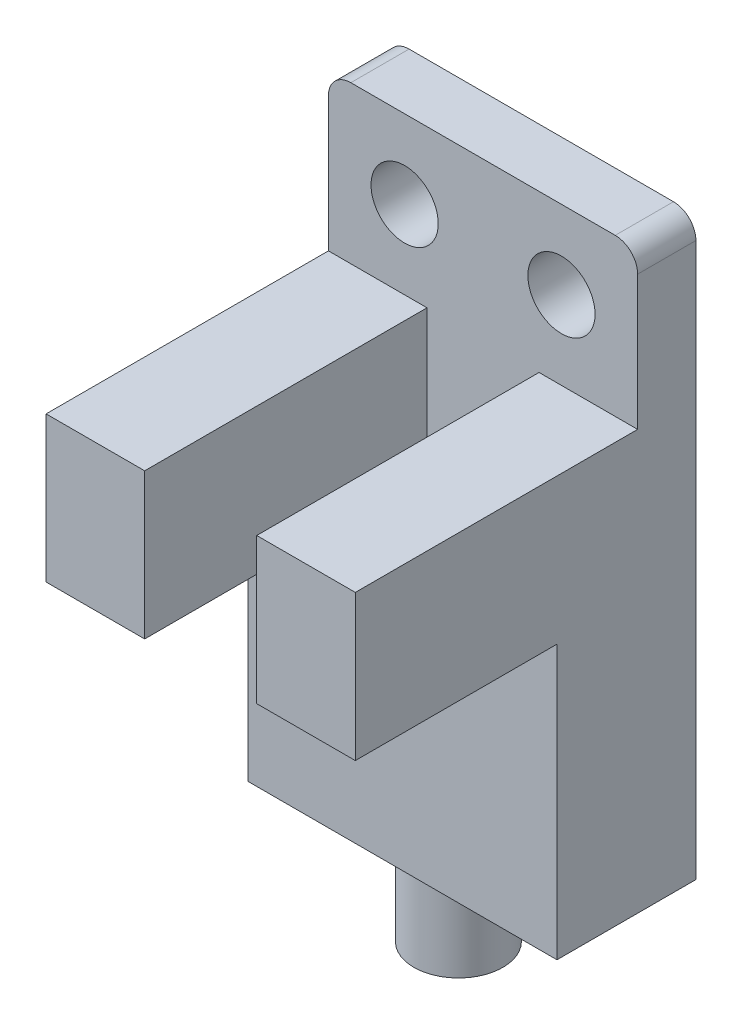
ISO-10303-21;
HEADER;
FILE_DESCRIPTION(('STEP AP214'),'2;1');
FILE_NAME('part.step','',(''),(''),'','','');
FILE_SCHEMA(('AUTOMOTIVE_DESIGN { 1 0 10303 214 1 1 1 1 }'));
ENDSEC;
DATA;
#1=APPLICATION_CONTEXT('core data for automotive mechanical design processes');
#2=APPLICATION_PROTOCOL_DEFINITION('international standard','automotive_design',2000,#1);
#3=PRODUCT_CONTEXT('',#1,'mechanical');
#4=PRODUCT('Part','Part','',(#3));
#5=PRODUCT_RELATED_PRODUCT_CATEGORY('part','',(#4));
#6=PRODUCT_DEFINITION_FORMATION('','',#4);
#7=PRODUCT_DEFINITION_CONTEXT('part definition',#1,'design');
#8=PRODUCT_DEFINITION('design','',#6,#7);
#9=PRODUCT_DEFINITION_SHAPE('','',#8);
#10=(LENGTH_UNIT() NAMED_UNIT(*) SI_UNIT(.MILLI.,.METRE.));
#11=(NAMED_UNIT(*) PLANE_ANGLE_UNIT() SI_UNIT($,.RADIAN.));
#12=(NAMED_UNIT(*) SI_UNIT($,.STERADIAN.) SOLID_ANGLE_UNIT());
#13=UNCERTAINTY_MEASURE_WITH_UNIT(LENGTH_MEASURE(1.E-05),#10,'distance_accuracy_value','');
#14=(GEOMETRIC_REPRESENTATION_CONTEXT(3) GLOBAL_UNCERTAINTY_ASSIGNED_CONTEXT((#13)) GLOBAL_UNIT_ASSIGNED_CONTEXT((#10,
#11,#12)) REPRESENTATION_CONTEXT('',''));
#15=CARTESIAN_POINT('',(0.,0.,0.));
#16=DIRECTION('',(0.,0.,1.));
#17=DIRECTION('',(1.,0.,0.));
#18=AXIS2_PLACEMENT_3D('',#15,#16,#17);
#19=CARTESIAN_POINT('',(0.,-4.,0.));
#20=DIRECTION('',(0.,-1.,0.));
#21=DIRECTION('',(0.,0.,-1.));
#22=AXIS2_PLACEMENT_3D('',#19,#20,#21);
#23=PLANE('',#22);
#24=CARTESIAN_POINT('',(6.9,-4.,3.69876481393757));
#25=DIRECTION('',(0.,1.,0.));
#26=DIRECTION('',(0.,0.,1.));
#27=AXIS2_PLACEMENT_3D('',#24,#25,#26);
#28=CIRCLE('',#27,1.98716484330452);
#29=CARTESIAN_POINT('',(6.9,-4.,5.68592965724209));
#30=VERTEX_POINT('',#29);
#31=EDGE_CURVE('E211',#30,#30,#28,.T.);
#32=ORIENTED_EDGE('',*,*,#31,.F.);
#33=EDGE_LOOP('',(#32));
#34=FACE_BOUND('',#33,.T.);
#35=ADVANCED_FACE('F19',(#34),#23,.T.);
#36=CARTESIAN_POINT('',(9.4,12.2,15.2));
#37=DIRECTION('',(1.,0.,0.));
#38=DIRECTION('',(0.,0.,-1.));
#39=AXIS2_PLACEMENT_3D('',#36,#37,#38);
#40=PLANE('',#39);
#41=DIRECTION('',(0.,0.,1.));
#42=VECTOR('',#41,1.);
#43=CARTESIAN_POINT('',(9.4,12.2,6.2));
#44=LINE('',#43,#42);
#45=CARTESIAN_POINT('',(9.4,12.2,2.6));
#46=VERTEX_POINT('',#45);
#47=CARTESIAN_POINT('',(9.4,12.2,6.2));
#48=VERTEX_POINT('',#47);
#49=EDGE_CURVE('E120',#46,#48,#44,.T.);
#50=ORIENTED_EDGE('',*,*,#49,.T.);
#51=DIRECTION('',(0.,0.,1.));
#52=VECTOR('',#51,1.);
#53=CARTESIAN_POINT('',(9.4,12.2,15.2));
#54=LINE('',#53,#52);
#55=CARTESIAN_POINT('',(9.4,12.2,15.2));
#56=VERTEX_POINT('',#55);
#57=EDGE_CURVE('E171',#48,#56,#54,.T.);
#58=ORIENTED_EDGE('',*,*,#57,.T.);
#59=DIRECTION('',(0.,1.,0.));
#60=VECTOR('',#59,1.);
#61=CARTESIAN_POINT('',(9.4,0.,15.2));
#62=LINE('',#61,#60);
#63=CARTESIAN_POINT('',(9.4,18.7,15.2));
#64=VERTEX_POINT('',#63);
#65=EDGE_CURVE('E173',#64,#56,#62,.F.);
#66=ORIENTED_EDGE('',*,*,#65,.F.);
#67=DIRECTION('',(0.,0.,-1.));
#68=VECTOR('',#67,1.);
#69=CARTESIAN_POINT('',(9.4,18.7,15.2));
#70=LINE('',#69,#68);
#71=CARTESIAN_POINT('',(9.4,18.7,2.6));
#72=VERTEX_POINT('',#71);
#73=EDGE_CURVE('E123',#64,#72,#70,.T.);
#74=ORIENTED_EDGE('',*,*,#73,.T.);
#75=DIRECTION('',(0.,1.,0.));
#76=VECTOR('',#75,1.);
#77=CARTESIAN_POINT('',(9.4,0.,2.6));
#78=LINE('',#77,#76);
#79=EDGE_CURVE('E117',#72,#46,#78,.F.);
#80=ORIENTED_EDGE('',*,*,#79,.T.);
#81=EDGE_LOOP('',(#50,#58,#66,#74,#80));
#82=FACE_BOUND('',#81,.T.);
#83=ADVANCED_FACE('F119',(#82),#40,.F.);
#84=CARTESIAN_POINT('',(0.,12.2,6.2));
#85=DIRECTION('',(0.,-1.,0.));
#86=DIRECTION('',(1.,0.,0.));
#87=AXIS2_PLACEMENT_3D('',#84,#85,#86);
#88=PLANE('',#87);
#89=DIRECTION('',(-1.,0.,0.));
#90=VECTOR('',#89,1.);
#91=CARTESIAN_POINT('',(0.,12.2,2.6));
#92=LINE('',#91,#90);
#93=CARTESIAN_POINT('',(4.4,12.2,2.6));
#94=VERTEX_POINT('',#93);
#95=EDGE_CURVE('E128',#46,#94,#92,.T.);
#96=ORIENTED_EDGE('',*,*,#95,.T.);
#97=DIRECTION('',(0.,0.,1.));
#98=VECTOR('',#97,1.);
#99=CARTESIAN_POINT('',(4.4,12.2,15.2));
#100=LINE('',#99,#98);
#101=CARTESIAN_POINT('',(4.4,12.2,6.2));
#102=VERTEX_POINT('',#101);
#103=EDGE_CURVE('E137',#94,#102,#100,.T.);
#104=ORIENTED_EDGE('',*,*,#103,.T.);
#105=DIRECTION('',(1.,0.,0.));
#106=VECTOR('',#105,1.);
#107=CARTESIAN_POINT('',(0.,12.2,6.2));
#108=LINE('',#107,#106);
#109=EDGE_CURVE('E135',#48,#102,#108,.F.);
#110=ORIENTED_EDGE('',*,*,#109,.F.);
#111=ORIENTED_EDGE('',*,*,#49,.F.);
#112=EDGE_LOOP('',(#96,#104,#110,#111));
#113=FACE_BOUND('',#112,.T.);
#114=ADVANCED_FACE('F133',(#113),#88,.F.);
#115=CARTESIAN_POINT('',(4.4,12.2,15.2));
#116=DIRECTION('',(-1.,0.,0.));
#117=DIRECTION('',(0.,0.,1.));
#118=AXIS2_PLACEMENT_3D('',#115,#116,#117);
#119=PLANE('',#118);
#120=DIRECTION('',(0.,0.,-1.));
#121=VECTOR('',#120,1.);
#122=CARTESIAN_POINT('',(4.4,18.7,15.2));
#123=LINE('',#122,#121);
#124=CARTESIAN_POINT('',(4.4,18.7,2.6));
#125=VERTEX_POINT('',#124);
#126=CARTESIAN_POINT('',(4.4,18.7,15.2));
#127=VERTEX_POINT('',#126);
#128=EDGE_CURVE('E213',#125,#127,#123,.F.);
#129=ORIENTED_EDGE('',*,*,#128,.T.);
#130=DIRECTION('',(0.,1.,0.));
#131=VECTOR('',#130,1.);
#132=CARTESIAN_POINT('',(4.4,0.,15.2));
#133=LINE('',#132,#131);
#134=CARTESIAN_POINT('',(4.4,12.2,15.2));
#135=VERTEX_POINT('',#134);
#136=EDGE_CURVE('E176',#127,#135,#133,.F.);
#137=ORIENTED_EDGE('',*,*,#136,.T.);
#138=DIRECTION('',(0.,0.,1.));
#139=VECTOR('',#138,1.);
#140=CARTESIAN_POINT('',(4.4,12.2,15.2));
#141=LINE('',#140,#139);
#142=EDGE_CURVE('E160',#135,#102,#141,.F.);
#143=ORIENTED_EDGE('',*,*,#142,.T.);
#144=ORIENTED_EDGE('',*,*,#103,.F.);
#145=DIRECTION('',(0.,1.,0.));
#146=VECTOR('',#145,1.);
#147=CARTESIAN_POINT('',(4.4,0.,2.6));
#148=LINE('',#147,#146);
#149=EDGE_CURVE('E82',#94,#125,#148,.T.);
#150=ORIENTED_EDGE('',*,*,#149,.T.);
#151=EDGE_LOOP('',(#129,#137,#143,#144,#150));
#152=FACE_BOUND('',#151,.T.);
#153=ADVANCED_FACE('F228',(#152),#119,.F.);
#154=CARTESIAN_POINT('',(13.8,12.2,15.2));
#155=DIRECTION('',(0.,1.,0.));
#156=DIRECTION('',(-1.,0.,0.));
#157=AXIS2_PLACEMENT_3D('',#154,#155,#156);
#158=PLANE('',#157);
#159=DIRECTION('',(0.,0.,1.));
#160=VECTOR('',#159,1.);
#161=CARTESIAN_POINT('',(13.8,12.2,2.6));
#162=LINE('',#161,#160);
#163=CARTESIAN_POINT('',(13.8,12.2,6.2));
#164=VERTEX_POINT('',#163);
#165=CARTESIAN_POINT('',(13.8,12.2,15.2));
#166=VERTEX_POINT('',#165);
#167=EDGE_CURVE('E254',#164,#166,#162,.T.);
#168=ORIENTED_EDGE('',*,*,#167,.T.);
#169=DIRECTION('',(1.,0.,0.));
#170=VECTOR('',#169,1.);
#171=CARTESIAN_POINT('',(0.,12.2,15.2));
#172=LINE('',#171,#170);
#173=EDGE_CURVE('E184',#56,#166,#172,.T.);
#174=ORIENTED_EDGE('',*,*,#173,.F.);
#175=ORIENTED_EDGE('',*,*,#57,.F.);
#176=DIRECTION('',(1.,0.,0.));
#177=VECTOR('',#176,1.);
#178=CARTESIAN_POINT('',(0.,12.2,6.2));
#179=LINE('',#178,#177);
#180=EDGE_CURVE('E163',#164,#48,#179,.F.);
#181=ORIENTED_EDGE('',*,*,#180,.F.);
#182=EDGE_LOOP('',(#168,#174,#175,#181));
#183=FACE_BOUND('',#182,.T.);
#184=ADVANCED_FACE('F529',(#183),#158,.F.);
#185=CARTESIAN_POINT('',(0.,0.,15.2));
#186=DIRECTION('',(0.,0.,1.));
#187=DIRECTION('',(1.,0.,0.));
#188=AXIS2_PLACEMENT_3D('',#185,#186,#187);
#189=PLANE('',#188);
#190=ORIENTED_EDGE('',*,*,#65,.T.);
#191=ORIENTED_EDGE('',*,*,#173,.T.);
#192=DIRECTION('',(0.,1.,0.));
#193=VECTOR('',#192,1.);
#194=CARTESIAN_POINT('',(13.8,0.,15.2));
#195=LINE('',#194,#193);
#196=CARTESIAN_POINT('',(13.8,18.7,15.2));
#197=VERTEX_POINT('',#196);
#198=EDGE_CURVE('E256',#166,#197,#195,.T.);
#199=ORIENTED_EDGE('',*,*,#198,.T.);
#200=DIRECTION('',(1.,0.,0.));
#201=VECTOR('',#200,1.);
#202=CARTESIAN_POINT('',(13.8,18.7,15.2));
#203=LINE('',#202,#201);
#204=EDGE_CURVE('E157',#197,#64,#203,.F.);
#205=ORIENTED_EDGE('',*,*,#204,.T.);
#206=EDGE_LOOP('',(#190,#191,#199,#205));
#207=FACE_BOUND('',#206,.T.);
#208=ADVANCED_FACE('F520',(#207),#189,.T.);
#209=CARTESIAN_POINT('',(13.8,18.7,15.2));
#210=DIRECTION('',(0.,-1.,0.));
#211=DIRECTION('',(0.,0.,-1.));
#212=AXIS2_PLACEMENT_3D('',#209,#210,#211);
#213=PLANE('',#212);
#214=ORIENTED_EDGE('',*,*,#73,.F.);
#215=ORIENTED_EDGE('',*,*,#204,.F.);
#216=DIRECTION('',(0.,0.,1.));
#217=VECTOR('',#216,1.);
#218=CARTESIAN_POINT('',(13.8,18.7,2.6));
#219=LINE('',#218,#217);
#220=CARTESIAN_POINT('',(13.8,18.7,2.6));
#221=VERTEX_POINT('',#220);
#222=EDGE_CURVE('E264',#197,#221,#219,.F.);
#223=ORIENTED_EDGE('',*,*,#222,.T.);
#224=DIRECTION('',(-1.,0.,0.));
#225=VECTOR('',#224,1.);
#226=CARTESIAN_POINT('',(0.,18.7,2.6));
#227=LINE('',#226,#225);
#228=EDGE_CURVE('E129',#221,#72,#227,.T.);
#229=ORIENTED_EDGE('',*,*,#228,.T.);
#230=EDGE_LOOP('',(#214,#215,#223,#229));
#231=FACE_BOUND('',#230,.T.);
#232=ADVANCED_FACE('F512',(#231),#213,.F.);
#233=CARTESIAN_POINT('',(12.8,24.7,2.6));
#234=DIRECTION('',(0.,0.,-1.));
#235=DIRECTION('',(-1.,0.,0.));
#236=AXIS2_PLACEMENT_3D('',#233,#234,#235);
#237=CYLINDRICAL_SURFACE('',#236,1.);
#238=CARTESIAN_POINT('',(12.8,24.7,0.));
#239=DIRECTION('',(0.,0.,-1.));
#240=DIRECTION('',(-1.,0.,0.));
#241=AXIS2_PLACEMENT_3D('',#238,#239,#240);
#242=CIRCLE('',#241,1.);
#243=CARTESIAN_POINT('',(13.8,24.7,0.));
#244=VERTEX_POINT('',#243);
#245=CARTESIAN_POINT('',(12.8,25.7,0.));
#246=VERTEX_POINT('',#245);
#247=EDGE_CURVE('E22',#244,#246,#242,.F.);
#248=ORIENTED_EDGE('',*,*,#247,.T.);
#249=DIRECTION('',(0.,0.,-1.));
#250=VECTOR('',#249,1.);
#251=CARTESIAN_POINT('',(12.8,25.7,2.6));
#252=LINE('',#251,#250);
#253=CARTESIAN_POINT('',(12.8,25.7,2.6));
#254=VERTEX_POINT('',#253);
#255=EDGE_CURVE('E321',#246,#254,#252,.F.);
#256=ORIENTED_EDGE('',*,*,#255,.T.);
#257=CARTESIAN_POINT('',(12.8,24.7,2.6));
#258=DIRECTION('',(0.,0.,-1.));
#259=DIRECTION('',(-1.,0.,0.));
#260=AXIS2_PLACEMENT_3D('',#257,#258,#259);
#261=CIRCLE('',#260,1.);
#262=CARTESIAN_POINT('',(13.8,24.7,2.6));
#263=VERTEX_POINT('',#262);
#264=EDGE_CURVE('E207',#254,#263,#261,.T.);
#265=ORIENTED_EDGE('',*,*,#264,.T.);
#266=DIRECTION('',(0.,0.,1.));
#267=VECTOR('',#266,1.);
#268=CARTESIAN_POINT('',(13.8,24.7,2.6));
#269=LINE('',#268,#267);
#270=EDGE_CURVE('E199',#263,#244,#269,.F.);
#271=ORIENTED_EDGE('',*,*,#270,.T.);
#272=EDGE_LOOP('',(#248,#256,#265,#271));
#273=FACE_BOUND('',#272,.T.);
#274=ADVANCED_FACE('F387',(#273),#237,.T.);
#275=CARTESIAN_POINT('',(6.9,-4.,3.69876481393757));
#276=DIRECTION('',(0.,1.,0.));
#277=DIRECTION('',(0.,0.,1.));
#278=AXIS2_PLACEMENT_3D('',#275,#276,#277);
#279=CYLINDRICAL_SURFACE('',#278,1.98716484330452);
#280=ORIENTED_EDGE('',*,*,#31,.T.);
#281=EDGE_LOOP('',(#280));
#282=FACE_BOUND('',#281,.T.);
#283=CARTESIAN_POINT('',(6.9,0.,3.69876481393757));
#284=DIRECTION('',(0.,1.,0.));
#285=DIRECTION('',(0.,0.,1.));
#286=AXIS2_PLACEMENT_3D('',#283,#284,#285);
#287=CIRCLE('',#286,1.98716484330452);
#288=CARTESIAN_POINT('',(6.9,0.,5.68592965724209));
#289=VERTEX_POINT('',#288);
#290=EDGE_CURVE('E195',#289,#289,#287,.F.);
#291=ORIENTED_EDGE('',*,*,#290,.T.);
#292=EDGE_LOOP('',(#291));
#293=FACE_BOUND('',#292,.T.);
#294=ADVANCED_FACE('F379',(#282,#293),#279,.T.);
#295=CARTESIAN_POINT('',(0.,18.7,15.2));
#296=DIRECTION('',(0.,-1.,0.));
#297=DIRECTION('',(0.,0.,-1.));
#298=AXIS2_PLACEMENT_3D('',#295,#296,#297);
#299=PLANE('',#298);
#300=DIRECTION('',(0.,0.,-1.));
#301=VECTOR('',#300,1.);
#302=CARTESIAN_POINT('',(0.,18.7,2.6));
#303=LINE('',#302,#301);
#304=CARTESIAN_POINT('',(0.,18.7,2.6));
#305=VERTEX_POINT('',#304);
#306=CARTESIAN_POINT('',(0.,18.7,15.2));
#307=VERTEX_POINT('',#306);
#308=EDGE_CURVE('E291',#305,#307,#303,.F.);
#309=ORIENTED_EDGE('',*,*,#308,.T.);
#310=DIRECTION('',(-1.,0.,0.));
#311=VECTOR('',#310,1.);
#312=CARTESIAN_POINT('',(0.,18.7,15.2));
#313=LINE('',#312,#311);
#314=EDGE_CURVE('E179',#307,#127,#313,.F.);
#315=ORIENTED_EDGE('',*,*,#314,.T.);
#316=ORIENTED_EDGE('',*,*,#128,.F.);
#317=DIRECTION('',(-1.,0.,0.));
#318=VECTOR('',#317,1.);
#319=CARTESIAN_POINT('',(0.,18.7,2.6));
#320=LINE('',#319,#318);
#321=EDGE_CURVE('E144',#125,#305,#320,.T.);
#322=ORIENTED_EDGE('',*,*,#321,.T.);
#323=EDGE_LOOP('',(#309,#315,#316,#322));
#324=FACE_BOUND('',#323,.T.);
#325=ADVANCED_FACE('F377',(#324),#299,.F.);
#326=CARTESIAN_POINT('',(0.,0.,15.2));
#327=DIRECTION('',(0.,0.,-1.));
#328=DIRECTION('',(-1.,0.,0.));
#329=AXIS2_PLACEMENT_3D('',#326,#327,#328);
#330=PLANE('',#329);
#331=DIRECTION('',(1.,0.,0.));
#332=VECTOR('',#331,1.);
#333=CARTESIAN_POINT('',(0.,12.2,15.2));
#334=LINE('',#333,#332);
#335=CARTESIAN_POINT('',(0.,12.2,15.2));
#336=VERTEX_POINT('',#335);
#337=EDGE_CURVE('E164',#336,#135,#334,.T.);
#338=ORIENTED_EDGE('',*,*,#337,.T.);
#339=ORIENTED_EDGE('',*,*,#136,.F.);
#340=ORIENTED_EDGE('',*,*,#314,.F.);
#341=DIRECTION('',(0.,1.,0.));
#342=VECTOR('',#341,1.);
#343=CARTESIAN_POINT('',(0.,0.,15.2));
#344=LINE('',#343,#342);
#345=EDGE_CURVE('E288',#307,#336,#344,.F.);
#346=ORIENTED_EDGE('',*,*,#345,.T.);
#347=EDGE_LOOP('',(#338,#339,#340,#346));
#348=FACE_BOUND('',#347,.T.);
#349=ADVANCED_FACE('F376',(#348),#330,.F.);
#350=CARTESIAN_POINT('',(0.,12.2,15.2));
#351=DIRECTION('',(0.,1.,0.));
#352=DIRECTION('',(0.,0.,1.));
#353=AXIS2_PLACEMENT_3D('',#350,#351,#352);
#354=PLANE('',#353);
#355=ORIENTED_EDGE('',*,*,#142,.F.);
#356=ORIENTED_EDGE('',*,*,#337,.F.);
#357=DIRECTION('',(0.,0.,-1.));
#358=VECTOR('',#357,1.);
#359=CARTESIAN_POINT('',(0.,12.2,2.6));
#360=LINE('',#359,#358);
#361=CARTESIAN_POINT('',(0.,12.2,6.2));
#362=VERTEX_POINT('',#361);
#363=EDGE_CURVE('E237',#336,#362,#360,.T.);
#364=ORIENTED_EDGE('',*,*,#363,.T.);
#365=DIRECTION('',(1.,0.,0.));
#366=VECTOR('',#365,1.);
#367=CARTESIAN_POINT('',(0.,12.2,6.2));
#368=LINE('',#367,#366);
#369=EDGE_CURVE('E168',#102,#362,#368,.F.);
#370=ORIENTED_EDGE('',*,*,#369,.F.);
#371=EDGE_LOOP('',(#355,#356,#364,#370));
#372=FACE_BOUND('',#371,.T.);
#373=ADVANCED_FACE('F235',(#372),#354,.F.);
#374=CARTESIAN_POINT('',(0.,0.,6.2));
#375=DIRECTION('',(0.,0.,1.));
#376=DIRECTION('',(1.,0.,0.));
#377=AXIS2_PLACEMENT_3D('',#374,#375,#376);
#378=PLANE('',#377);
#379=DIRECTION('',(0.,1.,0.));
#380=VECTOR('',#379,1.);
#381=CARTESIAN_POINT('',(0.,0.,6.2));
#382=LINE('',#381,#380);
#383=CARTESIAN_POINT('',(0.,0.,6.2));
#384=VERTEX_POINT('',#383);
#385=EDGE_CURVE('E298',#362,#384,#382,.F.);
#386=ORIENTED_EDGE('',*,*,#385,.T.);
#387=DIRECTION('',(1.,0.,0.));
#388=VECTOR('',#387,1.);
#389=CARTESIAN_POINT('',(0.,0.,6.2));
#390=LINE('',#389,#388);
#391=CARTESIAN_POINT('',(13.8,0.,6.2));
#392=VERTEX_POINT('',#391);
#393=EDGE_CURVE('E198',#384,#392,#390,.T.);
#394=ORIENTED_EDGE('',*,*,#393,.T.);
#395=DIRECTION('',(0.,1.,0.));
#396=VECTOR('',#395,1.);
#397=CARTESIAN_POINT('',(13.8,0.,6.2));
#398=LINE('',#397,#396);
#399=EDGE_CURVE('E246',#392,#164,#398,.T.);
#400=ORIENTED_EDGE('',*,*,#399,.T.);
#401=ORIENTED_EDGE('',*,*,#180,.T.);
#402=ORIENTED_EDGE('',*,*,#109,.T.);
#403=ORIENTED_EDGE('',*,*,#369,.T.);
#404=EDGE_LOOP('',(#386,#394,#400,#401,#402,#403));
#405=FACE_BOUND('',#404,.T.);
#406=ADVANCED_FACE('F241',(#405),#378,.T.);
#407=CARTESIAN_POINT('',(1.,24.7,2.6));
#408=DIRECTION('',(0.,0.,-1.));
#409=DIRECTION('',(-1.,0.,0.));
#410=AXIS2_PLACEMENT_3D('',#407,#408,#409);
#411=CYLINDRICAL_SURFACE('',#410,1.);
#412=CARTESIAN_POINT('',(1.,24.7,0.));
#413=DIRECTION('',(0.,0.,-1.));
#414=DIRECTION('',(-1.,0.,0.));
#415=AXIS2_PLACEMENT_3D('',#412,#413,#414);
#416=CIRCLE('',#415,1.);
#417=CARTESIAN_POINT('',(1.,25.7,0.));
#418=VERTEX_POINT('',#417);
#419=CARTESIAN_POINT('',(0.,24.7,0.));
#420=VERTEX_POINT('',#419);
#421=EDGE_CURVE('E37',#418,#420,#416,.F.);
#422=ORIENTED_EDGE('',*,*,#421,.T.);
#423=DIRECTION('',(0.,0.,-1.));
#424=VECTOR('',#423,1.);
#425=CARTESIAN_POINT('',(0.,24.7,2.6));
#426=LINE('',#425,#424);
#427=CARTESIAN_POINT('',(0.,24.7,2.6));
#428=VERTEX_POINT('',#427);
#429=EDGE_CURVE('E61',#420,#428,#426,.F.);
#430=ORIENTED_EDGE('',*,*,#429,.T.);
#431=CARTESIAN_POINT('',(1.,24.7,2.6));
#432=DIRECTION('',(0.,0.,-1.));
#433=DIRECTION('',(-1.,0.,0.));
#434=AXIS2_PLACEMENT_3D('',#431,#432,#433);
#435=CIRCLE('',#434,1.);
#436=CARTESIAN_POINT('',(1.,25.7,2.6));
#437=VERTEX_POINT('',#436);
#438=EDGE_CURVE('E72',#428,#437,#435,.T.);
#439=ORIENTED_EDGE('',*,*,#438,.T.);
#440=DIRECTION('',(0.,0.,-1.));
#441=VECTOR('',#440,1.);
#442=CARTESIAN_POINT('',(1.,25.7,2.6));
#443=LINE('',#442,#441);
#444=EDGE_CURVE('E203',#437,#418,#443,.T.);
#445=ORIENTED_EDGE('',*,*,#444,.T.);
#446=EDGE_LOOP('',(#422,#430,#439,#445));
#447=FACE_BOUND('',#446,.T.);
#448=ADVANCED_FACE('F414',(#447),#411,.T.);
#449=CARTESIAN_POINT('',(0.,0.,2.6));
#450=DIRECTION('',(0.,0.,-1.));
#451=DIRECTION('',(-1.,0.,0.));
#452=AXIS2_PLACEMENT_3D('',#449,#450,#451);
#453=PLANE('',#452);
#454=ORIENTED_EDGE('',*,*,#264,.F.);
#455=DIRECTION('',(1.,0.,0.));
#456=VECTOR('',#455,1.);
#457=CARTESIAN_POINT('',(0.,25.7,2.6));
#458=LINE('',#457,#456);
#459=EDGE_CURVE('E221',#254,#437,#458,.F.);
#460=ORIENTED_EDGE('',*,*,#459,.T.);
#461=ORIENTED_EDGE('',*,*,#438,.F.);
#462=DIRECTION('',(0.,1.,0.));
#463=VECTOR('',#462,1.);
#464=CARTESIAN_POINT('',(0.,0.,2.6));
#465=LINE('',#464,#463);
#466=EDGE_CURVE('E194',#428,#305,#465,.F.);
#467=ORIENTED_EDGE('',*,*,#466,.T.);
#468=ORIENTED_EDGE('',*,*,#321,.F.);
#469=ORIENTED_EDGE('',*,*,#149,.F.);
#470=ORIENTED_EDGE('',*,*,#95,.F.);
#471=ORIENTED_EDGE('',*,*,#79,.F.);
#472=ORIENTED_EDGE('',*,*,#228,.F.);
#473=DIRECTION('',(0.,1.,0.));
#474=VECTOR('',#473,1.);
#475=CARTESIAN_POINT('',(13.8,0.,2.6));
#476=LINE('',#475,#474);
#477=EDGE_CURVE('E273',#221,#263,#476,.T.);
#478=ORIENTED_EDGE('',*,*,#477,.T.);
#479=EDGE_LOOP('',(#454,#460,#461,#467,#468,#469,#470,#471,#472,#478));
#480=FACE_BOUND('',#479,.T.);
#481=CARTESIAN_POINT('',(3.4,22.2,2.6));
#482=DIRECTION('',(0.,0.,1.));
#483=DIRECTION('',(1.,0.,0.));
#484=AXIS2_PLACEMENT_3D('',#481,#482,#483);
#485=CIRCLE('',#484,1.5);
#486=CARTESIAN_POINT('',(4.9,22.2,2.6));
#487=VERTEX_POINT('',#486);
#488=EDGE_CURVE('E200',#487,#487,#485,.F.);
#489=ORIENTED_EDGE('',*,*,#488,.T.);
#490=EDGE_LOOP('',(#489));
#491=FACE_BOUND('',#490,.T.);
#492=CARTESIAN_POINT('',(10.4,22.2,2.6));
#493=DIRECTION('',(0.,0.,1.));
#494=DIRECTION('',(1.,0.,0.));
#495=AXIS2_PLACEMENT_3D('',#492,#493,#494);
#496=CIRCLE('',#495,1.5);
#497=CARTESIAN_POINT('',(11.9,22.2,2.6));
#498=VERTEX_POINT('',#497);
#499=EDGE_CURVE('E204',#498,#498,#496,.F.);
#500=ORIENTED_EDGE('',*,*,#499,.T.);
#501=EDGE_LOOP('',(#500));
#502=FACE_BOUND('',#501,.T.);
#503=ADVANCED_FACE('F140',(#480,#491,#502),#453,.F.);
#504=CARTESIAN_POINT('',(10.4,22.2,-1.4));
#505=DIRECTION('',(0.,0.,1.));
#506=DIRECTION('',(1.,0.,0.));
#507=AXIS2_PLACEMENT_3D('',#504,#505,#506);
#508=CYLINDRICAL_SURFACE('',#507,1.5);
#509=CARTESIAN_POINT('',(10.4,22.2,0.));
#510=DIRECTION('',(0.,0.,1.));
#511=DIRECTION('',(1.,0.,0.));
#512=AXIS2_PLACEMENT_3D('',#509,#510,#511);
#513=CIRCLE('',#512,1.5);
#514=CARTESIAN_POINT('',(11.9,22.2,0.));
#515=VERTEX_POINT('',#514);
#516=EDGE_CURVE('E191',#515,#515,#513,.T.);
#517=ORIENTED_EDGE('',*,*,#516,.F.);
#518=EDGE_LOOP('',(#517));
#519=FACE_BOUND('',#518,.T.);
#520=ORIENTED_EDGE('',*,*,#499,.F.);
#521=EDGE_LOOP('',(#520));
#522=FACE_BOUND('',#521,.T.);
#523=ADVANCED_FACE('F407',(#519,#522),#508,.F.);
#524=CARTESIAN_POINT('',(3.4,22.2,-1.4));
#525=DIRECTION('',(0.,0.,1.));
#526=DIRECTION('',(1.,0.,0.));
#527=AXIS2_PLACEMENT_3D('',#524,#525,#526);
#528=CYLINDRICAL_SURFACE('',#527,1.5);
#529=CARTESIAN_POINT('',(3.4,22.2,0.));
#530=DIRECTION('',(0.,0.,1.));
#531=DIRECTION('',(1.,0.,0.));
#532=AXIS2_PLACEMENT_3D('',#529,#530,#531);
#533=CIRCLE('',#532,1.5);
#534=CARTESIAN_POINT('',(4.9,22.2,0.));
#535=VERTEX_POINT('',#534);
#536=EDGE_CURVE('E187',#535,#535,#533,.T.);
#537=ORIENTED_EDGE('',*,*,#536,.F.);
#538=EDGE_LOOP('',(#537));
#539=FACE_BOUND('',#538,.T.);
#540=ORIENTED_EDGE('',*,*,#488,.F.);
#541=EDGE_LOOP('',(#540));
#542=FACE_BOUND('',#541,.T.);
#543=ADVANCED_FACE('F403',(#539,#542),#528,.F.);
#544=CARTESIAN_POINT('',(0.,25.7,2.6));
#545=DIRECTION('',(0.,-1.,0.));
#546=DIRECTION('',(0.,0.,-1.));
#547=AXIS2_PLACEMENT_3D('',#544,#545,#546);
#548=PLANE('',#547);
#549=ORIENTED_EDGE('',*,*,#255,.F.);
#550=DIRECTION('',(-1.,0.,0.));
#551=VECTOR('',#550,1.);
#552=CARTESIAN_POINT('',(0.,25.7,0.));
#553=LINE('',#552,#551);
#554=EDGE_CURVE('E190',#418,#246,#553,.F.);
#555=ORIENTED_EDGE('',*,*,#554,.F.);
#556=ORIENTED_EDGE('',*,*,#444,.F.);
#557=ORIENTED_EDGE('',*,*,#459,.F.);
#558=EDGE_LOOP('',(#549,#555,#556,#557));
#559=FACE_BOUND('',#558,.T.);
#560=ADVANCED_FACE('F400',(#559),#548,.F.);
#561=CARTESIAN_POINT('',(13.8,0.,2.6));
#562=DIRECTION('',(-1.,0.,0.));
#563=DIRECTION('',(0.,0.,1.));
#564=AXIS2_PLACEMENT_3D('',#561,#562,#563);
#565=PLANE('',#564);
#566=ORIENTED_EDGE('',*,*,#270,.F.);
#567=ORIENTED_EDGE('',*,*,#477,.F.);
#568=ORIENTED_EDGE('',*,*,#222,.F.);
#569=ORIENTED_EDGE('',*,*,#198,.F.);
#570=ORIENTED_EDGE('',*,*,#167,.F.);
#571=ORIENTED_EDGE('',*,*,#399,.F.);
#572=DIRECTION('',(0.,0.,1.));
#573=VECTOR('',#572,1.);
#574=CARTESIAN_POINT('',(13.8,0.,2.6));
#575=LINE('',#574,#573);
#576=CARTESIAN_POINT('',(13.8,0.,0.));
#577=VERTEX_POINT('',#576);
#578=EDGE_CURVE('E308',#392,#577,#575,.F.);
#579=ORIENTED_EDGE('',*,*,#578,.T.);
#580=DIRECTION('',(0.,1.,0.));
#581=VECTOR('',#580,1.);
#582=CARTESIAN_POINT('',(13.8,0.,0.));
#583=LINE('',#582,#581);
#584=EDGE_CURVE('E332',#244,#577,#583,.F.);
#585=ORIENTED_EDGE('',*,*,#584,.F.);
#586=EDGE_LOOP('',(#566,#567,#568,#569,#570,#571,#579,#585));
#587=FACE_BOUND('',#586,.T.);
#588=ADVANCED_FACE('F348',(#587),#565,.F.);
#589=CARTESIAN_POINT('',(0.,0.,2.6));
#590=DIRECTION('',(0.,1.,0.));
#591=DIRECTION('',(0.,0.,1.));
#592=AXIS2_PLACEMENT_3D('',#589,#590,#591);
#593=PLANE('',#592);
#594=ORIENTED_EDGE('',*,*,#578,.F.);
#595=ORIENTED_EDGE('',*,*,#393,.F.);
#596=DIRECTION('',(0.,0.,-1.));
#597=VECTOR('',#596,1.);
#598=CARTESIAN_POINT('',(0.,0.,2.6));
#599=LINE('',#598,#597);
#600=CARTESIAN_POINT('',(0.,0.,0.));
#601=VERTEX_POINT('',#600);
#602=EDGE_CURVE('E304',#384,#601,#599,.T.);
#603=ORIENTED_EDGE('',*,*,#602,.T.);
#604=DIRECTION('',(-1.,0.,0.));
#605=VECTOR('',#604,1.);
#606=CARTESIAN_POINT('',(0.,0.,0.));
#607=LINE('',#606,#605);
#608=EDGE_CURVE('E28',#577,#601,#607,.T.);
#609=ORIENTED_EDGE('',*,*,#608,.F.);
#610=EDGE_LOOP('',(#594,#595,#603,#609));
#611=FACE_BOUND('',#610,.T.);
#612=ORIENTED_EDGE('',*,*,#290,.F.);
#613=EDGE_LOOP('',(#612));
#614=FACE_BOUND('',#613,.T.);
#615=ADVANCED_FACE('F354',(#611,#614),#593,.F.);
#616=CARTESIAN_POINT('',(0.,0.,2.6));
#617=DIRECTION('',(1.,0.,0.));
#618=DIRECTION('',(0.,0.,-1.));
#619=AXIS2_PLACEMENT_3D('',#616,#617,#618);
#620=PLANE('',#619);
#621=ORIENTED_EDGE('',*,*,#429,.F.);
#622=DIRECTION('',(0.,1.,0.));
#623=VECTOR('',#622,1.);
#624=CARTESIAN_POINT('',(0.,0.,0.));
#625=LINE('',#624,#623);
#626=EDGE_CURVE('E11',#601,#420,#625,.T.);
#627=ORIENTED_EDGE('',*,*,#626,.F.);
#628=ORIENTED_EDGE('',*,*,#602,.F.);
#629=ORIENTED_EDGE('',*,*,#385,.F.);
#630=ORIENTED_EDGE('',*,*,#363,.F.);
#631=ORIENTED_EDGE('',*,*,#345,.F.);
#632=ORIENTED_EDGE('',*,*,#308,.F.);
#633=ORIENTED_EDGE('',*,*,#466,.F.);
#634=EDGE_LOOP('',(#621,#627,#628,#629,#630,#631,#632,#633));
#635=FACE_BOUND('',#634,.T.);
#636=ADVANCED_FACE('F359',(#635),#620,.F.);
#637=CARTESIAN_POINT('',(0.,0.,0.));
#638=DIRECTION('',(0.,0.,-1.));
#639=DIRECTION('',(-1.,0.,0.));
#640=AXIS2_PLACEMENT_3D('',#637,#638,#639);
#641=PLANE('',#640);
#642=ORIENTED_EDGE('',*,*,#626,.T.);
#643=ORIENTED_EDGE('',*,*,#421,.F.);
#644=ORIENTED_EDGE('',*,*,#554,.T.);
#645=ORIENTED_EDGE('',*,*,#247,.F.);
#646=ORIENTED_EDGE('',*,*,#584,.T.);
#647=ORIENTED_EDGE('',*,*,#608,.T.);
#648=EDGE_LOOP('',(#642,#643,#644,#645,#646,#647));
#649=FACE_BOUND('',#648,.T.);
#650=ORIENTED_EDGE('',*,*,#536,.T.);
#651=EDGE_LOOP('',(#650));
#652=FACE_BOUND('',#651,.T.);
#653=ORIENTED_EDGE('',*,*,#516,.T.);
#654=EDGE_LOOP('',(#653));
#655=FACE_BOUND('',#654,.T.);
#656=ADVANCED_FACE('F343',(#649,#652,#655),#641,.T.);
#657=CLOSED_SHELL('',(#35,#83,#114,#153,#184,#208,#232,#274,#294,#325,#349,#373,#406,#448,#503,
#523,#543,#560,#588,#615,#636,#656));
#658=MANIFOLD_SOLID_BREP('B1',#657);
#659=ADVANCED_BREP_SHAPE_REPRESENTATION('',(#18,#658),#14);
#660=SHAPE_DEFINITION_REPRESENTATION(#9,#659);
ENDSEC;
END-ISO-10303-21;
